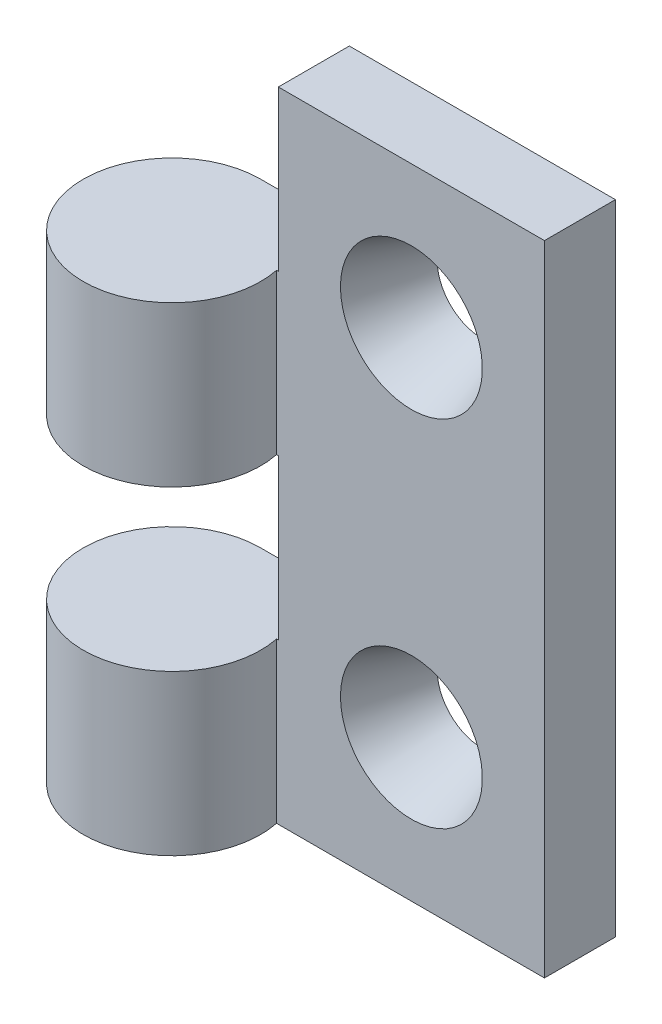
ISO-10303-21;
HEADER;
FILE_DESCRIPTION(('STEP AP214'),'2;1');
FILE_NAME('part.step','',(''),(''),'','','');
FILE_SCHEMA(('AUTOMOTIVE_DESIGN { 1 0 10303 214 1 1 1 1 }'));
ENDSEC;
DATA;
#1=APPLICATION_CONTEXT('core data for automotive mechanical design processes');
#2=APPLICATION_PROTOCOL_DEFINITION('international standard','automotive_design',2000,#1);
#3=PRODUCT_CONTEXT('',#1,'mechanical');
#4=PRODUCT('Part','Part','',(#3));
#5=PRODUCT_RELATED_PRODUCT_CATEGORY('part','',(#4));
#6=PRODUCT_DEFINITION_FORMATION('','',#4);
#7=PRODUCT_DEFINITION_CONTEXT('part definition',#1,'design');
#8=PRODUCT_DEFINITION('design','',#6,#7);
#9=PRODUCT_DEFINITION_SHAPE('','',#8);
#10=(LENGTH_UNIT() NAMED_UNIT(*) SI_UNIT(.MILLI.,.METRE.));
#11=(NAMED_UNIT(*) PLANE_ANGLE_UNIT() SI_UNIT($,.RADIAN.));
#12=(NAMED_UNIT(*) SI_UNIT($,.STERADIAN.) SOLID_ANGLE_UNIT());
#13=UNCERTAINTY_MEASURE_WITH_UNIT(LENGTH_MEASURE(1.E-05),#10,'distance_accuracy_value','');
#14=(GEOMETRIC_REPRESENTATION_CONTEXT(3) GLOBAL_UNCERTAINTY_ASSIGNED_CONTEXT((#13)) GLOBAL_UNIT_ASSIGNED_CONTEXT((#10,
#11,#12)) REPRESENTATION_CONTEXT('',''));
#15=CARTESIAN_POINT('',(0.,0.,0.));
#16=DIRECTION('',(0.,0.,1.));
#17=DIRECTION('',(1.,0.,0.));
#18=AXIS2_PLACEMENT_3D('',#15,#16,#17);
#19=CARTESIAN_POINT('',(0.,0.,4.));
#20=DIRECTION('',(0.,0.,-1.));
#21=DIRECTION('',(-1.,0.,0.));
#22=AXIS2_PLACEMENT_3D('',#19,#20,#21);
#23=PLANE('',#22);
#24=CARTESIAN_POINT('',(-7.5,28.,4.));
#25=DIRECTION('',(0.,0.,-1.));
#26=DIRECTION('',(-1.,0.,0.));
#27=AXIS2_PLACEMENT_3D('',#24,#25,#26);
#28=CIRCLE('',#27,4.00000000000002);
#29=CARTESIAN_POINT('',(-11.5,28.,4.));
#30=VERTEX_POINT('',#29);
#31=EDGE_CURVE('E131',#30,#30,#28,.T.);
#32=ORIENTED_EDGE('',*,*,#31,.T.);
#33=EDGE_LOOP('',(#32));
#34=FACE_BOUND('',#33,.T.);
#35=CARTESIAN_POINT('',(-7.5,8.,4.));
#36=DIRECTION('',(0.,0.,-1.));
#37=DIRECTION('',(-1.,0.,0.));
#38=AXIS2_PLACEMENT_3D('',#35,#36,#37);
#39=CIRCLE('',#38,4.00000000000003);
#40=CARTESIAN_POINT('',(-11.5,8.,4.));
#41=VERTEX_POINT('',#40);
#42=EDGE_CURVE('E133',#41,#41,#39,.T.);
#43=ORIENTED_EDGE('',*,*,#42,.T.);
#44=EDGE_LOOP('',(#43));
#45=FACE_BOUND('',#44,.T.);
#46=DIRECTION('',(1.,0.,0.));
#47=VECTOR('',#46,1.);
#48=CARTESIAN_POINT('',(0.,9.,4.));
#49=LINE('',#48,#47);
#50=CARTESIAN_POINT('',(-15.1010205144336,9.,4.));
#51=VERTEX_POINT('',#50);
#52=CARTESIAN_POINT('',(-15.,9.,4.));
#53=VERTEX_POINT('',#52);
#54=EDGE_CURVE('E192',#51,#53,#49,.T.);
#55=ORIENTED_EDGE('',*,*,#54,.F.);
#56=DIRECTION('',(0.,-1.,0.));
#57=VECTOR('',#56,1.);
#58=CARTESIAN_POINT('',(-15.1010205144336,36.,4.));
#59=LINE('',#58,#57);
#60=CARTESIAN_POINT('',(-15.1010205144336,0.,4.));
#61=VERTEX_POINT('',#60);
#62=EDGE_CURVE('E63',#51,#61,#59,.T.);
#63=ORIENTED_EDGE('',*,*,#62,.T.);
#64=DIRECTION('',(1.,0.,0.));
#65=VECTOR('',#64,1.);
#66=CARTESIAN_POINT('',(0.,0.,4.));
#67=LINE('',#66,#65);
#68=CARTESIAN_POINT('',(0.,0.,4.));
#69=VERTEX_POINT('',#68);
#70=EDGE_CURVE('E180',#61,#69,#67,.T.);
#71=ORIENTED_EDGE('',*,*,#70,.T.);
#72=DIRECTION('',(0.,1.,0.));
#73=VECTOR('',#72,1.);
#74=CARTESIAN_POINT('',(0.,0.,4.));
#75=LINE('',#74,#73);
#76=CARTESIAN_POINT('',(0.,36.,4.));
#77=VERTEX_POINT('',#76);
#78=EDGE_CURVE('E71',#69,#77,#75,.T.);
#79=ORIENTED_EDGE('',*,*,#78,.T.);
#80=DIRECTION('',(-1.,0.,0.));
#81=VECTOR('',#80,1.);
#82=CARTESIAN_POINT('',(0.,36.,4.));
#83=LINE('',#82,#81);
#84=CARTESIAN_POINT('',(-15.,36.,4.));
#85=VERTEX_POINT('',#84);
#86=EDGE_CURVE('E101',#77,#85,#83,.T.);
#87=ORIENTED_EDGE('',*,*,#86,.T.);
#88=DIRECTION('',(0.,-1.,0.));
#89=VECTOR('',#88,1.);
#90=CARTESIAN_POINT('',(-15.,0.,4.));
#91=LINE('',#90,#89);
#92=CARTESIAN_POINT('',(-15.,27.,4.));
#93=VERTEX_POINT('',#92);
#94=EDGE_CURVE('E214',#85,#93,#91,.T.);
#95=ORIENTED_EDGE('',*,*,#94,.T.);
#96=DIRECTION('',(1.,0.,0.));
#97=VECTOR('',#96,1.);
#98=CARTESIAN_POINT('',(0.,27.,4.));
#99=LINE('',#98,#97);
#100=CARTESIAN_POINT('',(-15.1010205144336,27.,4.));
#101=VERTEX_POINT('',#100);
#102=EDGE_CURVE('E210',#101,#93,#99,.T.);
#103=ORIENTED_EDGE('',*,*,#102,.F.);
#104=CARTESIAN_POINT('',(-15.1010205144336,18.,4.));
#105=VERTEX_POINT('',#104);
#106=EDGE_CURVE('E190',#101,#105,#59,.T.);
#107=ORIENTED_EDGE('',*,*,#106,.T.);
#108=DIRECTION('',(1.,0.,0.));
#109=VECTOR('',#108,1.);
#110=CARTESIAN_POINT('',(0.,18.,4.));
#111=LINE('',#110,#109);
#112=CARTESIAN_POINT('',(-15.,18.,4.));
#113=VERTEX_POINT('',#112);
#114=EDGE_CURVE('E160',#105,#113,#111,.T.);
#115=ORIENTED_EDGE('',*,*,#114,.T.);
#116=DIRECTION('',(0.,1.,0.));
#117=VECTOR('',#116,1.);
#118=CARTESIAN_POINT('',(-15.,0.,4.));
#119=LINE('',#118,#117);
#120=EDGE_CURVE('E200',#53,#113,#119,.T.);
#121=ORIENTED_EDGE('',*,*,#120,.F.);
#122=EDGE_LOOP('',(#55,#63,#71,#79,#87,#95,#103,#107,#115,#121));
#123=FACE_BOUND('',#122,.T.);
#124=ADVANCED_FACE('F50',(#34,#45,#123),#23,.F.);
#125=CARTESIAN_POINT('',(0.,0.,0.));
#126=DIRECTION('',(0.,0.,-1.));
#127=DIRECTION('',(-1.,0.,0.));
#128=AXIS2_PLACEMENT_3D('',#125,#126,#127);
#129=PLANE('',#128);
#130=DIRECTION('',(0.,-1.,0.));
#131=VECTOR('',#130,1.);
#132=CARTESIAN_POINT('',(-15.,36.,0.));
#133=LINE('',#132,#131);
#134=CARTESIAN_POINT('',(-15.,36.,0.));
#135=VERTEX_POINT('',#134);
#136=CARTESIAN_POINT('',(-15.,27.,0.));
#137=VERTEX_POINT('',#136);
#138=EDGE_CURVE('E111',#135,#137,#133,.T.);
#139=ORIENTED_EDGE('',*,*,#138,.F.);
#140=DIRECTION('',(-1.,0.,0.));
#141=VECTOR('',#140,1.);
#142=CARTESIAN_POINT('',(0.,36.,0.));
#143=LINE('',#142,#141);
#144=CARTESIAN_POINT('',(0.,36.,0.));
#145=VERTEX_POINT('',#144);
#146=EDGE_CURVE('E94',#145,#135,#143,.T.);
#147=ORIENTED_EDGE('',*,*,#146,.F.);
#148=DIRECTION('',(0.,1.,0.));
#149=VECTOR('',#148,1.);
#150=CARTESIAN_POINT('',(0.,0.,0.));
#151=LINE('',#150,#149);
#152=CARTESIAN_POINT('',(0.,0.,0.));
#153=VERTEX_POINT('',#152);
#154=EDGE_CURVE('E85',#153,#145,#151,.T.);
#155=ORIENTED_EDGE('',*,*,#154,.F.);
#156=DIRECTION('',(1.,0.,0.));
#157=VECTOR('',#156,1.);
#158=CARTESIAN_POINT('',(0.,0.,0.));
#159=LINE('',#158,#157);
#160=CARTESIAN_POINT('',(-20.,0.,0.));
#161=VERTEX_POINT('',#160);
#162=EDGE_CURVE('E98',#161,#153,#159,.T.);
#163=ORIENTED_EDGE('',*,*,#162,.F.);
#164=DIRECTION('',(0.,-1.,0.));
#165=VECTOR('',#164,1.);
#166=CARTESIAN_POINT('',(-20.,0.,0.));
#167=LINE('',#166,#165);
#168=CARTESIAN_POINT('',(-20.,9.,0.));
#169=VERTEX_POINT('',#168);
#170=EDGE_CURVE('E113',#169,#161,#167,.T.);
#171=ORIENTED_EDGE('',*,*,#170,.F.);
#172=DIRECTION('',(1.,0.,0.));
#173=VECTOR('',#172,1.);
#174=CARTESIAN_POINT('',(-25.,9.,0.));
#175=LINE('',#174,#173);
#176=CARTESIAN_POINT('',(-15.,9.,0.));
#177=VERTEX_POINT('',#176);
#178=EDGE_CURVE('E217',#169,#177,#175,.T.);
#179=ORIENTED_EDGE('',*,*,#178,.T.);
#180=DIRECTION('',(0.,1.,0.));
#181=VECTOR('',#180,1.);
#182=CARTESIAN_POINT('',(-15.,9.,0.));
#183=LINE('',#182,#181);
#184=CARTESIAN_POINT('',(-15.,18.,0.));
#185=VERTEX_POINT('',#184);
#186=EDGE_CURVE('E169',#177,#185,#183,.T.);
#187=ORIENTED_EDGE('',*,*,#186,.T.);
#188=DIRECTION('',(1.,0.,0.));
#189=VECTOR('',#188,1.);
#190=CARTESIAN_POINT('',(-25.,18.,0.));
#191=LINE('',#190,#189);
#192=CARTESIAN_POINT('',(-20.,18.,0.));
#193=VERTEX_POINT('',#192);
#194=EDGE_CURVE('E152',#193,#185,#191,.T.);
#195=ORIENTED_EDGE('',*,*,#194,.F.);
#196=CARTESIAN_POINT('',(-20.,27.,0.));
#197=VERTEX_POINT('',#196);
#198=EDGE_CURVE('E120',#197,#193,#167,.T.);
#199=ORIENTED_EDGE('',*,*,#198,.F.);
#200=DIRECTION('',(1.,0.,0.));
#201=VECTOR('',#200,1.);
#202=CARTESIAN_POINT('',(-25.,27.,0.));
#203=LINE('',#202,#201);
#204=EDGE_CURVE('E220',#197,#137,#203,.T.);
#205=ORIENTED_EDGE('',*,*,#204,.T.);
#206=EDGE_LOOP('',(#139,#147,#155,#163,#171,#179,#187,#195,#199,#205));
#207=FACE_BOUND('',#206,.T.);
#208=CARTESIAN_POINT('',(-7.5,28.,0.));
#209=DIRECTION('',(0.,0.,-1.));
#210=DIRECTION('',(-1.,0.,0.));
#211=AXIS2_PLACEMENT_3D('',#208,#209,#210);
#212=CIRCLE('',#211,2.54411906293523);
#213=CARTESIAN_POINT('',(-10.0441190629352,28.,0.));
#214=VERTEX_POINT('',#213);
#215=EDGE_CURVE('E126',#214,#214,#212,.F.);
#216=ORIENTED_EDGE('',*,*,#215,.T.);
#217=EDGE_LOOP('',(#216));
#218=FACE_BOUND('',#217,.T.);
#219=CARTESIAN_POINT('',(-7.5,8.,0.));
#220=DIRECTION('',(0.,0.,-1.));
#221=DIRECTION('',(-1.,0.,0.));
#222=AXIS2_PLACEMENT_3D('',#219,#220,#221);
#223=CIRCLE('',#222,2.54411906293523);
#224=CARTESIAN_POINT('',(-10.0441190629352,8.,0.));
#225=VERTEX_POINT('',#224);
#226=EDGE_CURVE('E124',#225,#225,#223,.F.);
#227=ORIENTED_EDGE('',*,*,#226,.T.);
#228=EDGE_LOOP('',(#227));
#229=FACE_BOUND('',#228,.T.);
#230=ADVANCED_FACE('F110',(#207,#218,#229),#129,.T.);
#231=CARTESIAN_POINT('',(0.,36.,4.));
#232=DIRECTION('',(0.,-1.,0.));
#233=DIRECTION('',(0.,0.,-1.));
#234=AXIS2_PLACEMENT_3D('',#231,#232,#233);
#235=PLANE('',#234);
#236=DIRECTION('',(0.,0.,-1.));
#237=VECTOR('',#236,1.);
#238=CARTESIAN_POINT('',(-15.,36.,10.));
#239=LINE('',#238,#237);
#240=EDGE_CURVE('E225',#85,#135,#239,.T.);
#241=ORIENTED_EDGE('',*,*,#240,.F.);
#242=ORIENTED_EDGE('',*,*,#86,.F.);
#243=DIRECTION('',(0.,0.,-1.));
#244=VECTOR('',#243,1.);
#245=CARTESIAN_POINT('',(0.,36.,4.));
#246=LINE('',#245,#244);
#247=EDGE_CURVE('E88',#77,#145,#246,.T.);
#248=ORIENTED_EDGE('',*,*,#247,.T.);
#249=ORIENTED_EDGE('',*,*,#146,.T.);
#250=EDGE_LOOP('',(#241,#242,#248,#249));
#251=FACE_BOUND('',#250,.T.);
#252=ADVANCED_FACE('F103',(#251),#235,.F.);
#253=CARTESIAN_POINT('',(-20.,36.,5.));
#254=DIRECTION('',(0.,-1.,0.));
#255=DIRECTION('',(0.,0.,-1.));
#256=AXIS2_PLACEMENT_3D('',#253,#254,#255);
#257=CYLINDRICAL_SURFACE('',#256,5.);
#258=CARTESIAN_POINT('',(-20.,9.,5.));
#259=DIRECTION('',(0.,1.,0.));
#260=DIRECTION('',(0.,0.,1.));
#261=AXIS2_PLACEMENT_3D('',#258,#259,#260);
#262=CIRCLE('',#261,5.);
#263=EDGE_CURVE('E11',#51,#169,#262,.F.);
#264=ORIENTED_EDGE('',*,*,#263,.T.);
#265=ORIENTED_EDGE('',*,*,#170,.T.);
#266=CARTESIAN_POINT('',(-20.,0.,5.));
#267=DIRECTION('',(0.,-1.,0.));
#268=DIRECTION('',(0.,0.,-1.));
#269=AXIS2_PLACEMENT_3D('',#266,#267,#268);
#270=CIRCLE('',#269,5.);
#271=EDGE_CURVE('E195',#61,#161,#270,.T.);
#272=ORIENTED_EDGE('',*,*,#271,.F.);
#273=ORIENTED_EDGE('',*,*,#62,.F.);
#274=EDGE_LOOP('',(#264,#265,#272,#273));
#275=FACE_BOUND('',#274,.T.);
#276=ADVANCED_FACE('F258',(#275),#257,.T.);
#277=ORIENTED_EDGE('',*,*,#198,.T.);
#278=CARTESIAN_POINT('',(-20.,18.,5.));
#279=DIRECTION('',(0.,1.,0.));
#280=DIRECTION('',(0.,0.,1.));
#281=AXIS2_PLACEMENT_3D('',#278,#279,#280);
#282=CIRCLE('',#281,5.);
#283=EDGE_CURVE('E60',#105,#193,#282,.F.);
#284=ORIENTED_EDGE('',*,*,#283,.F.);
#285=ORIENTED_EDGE('',*,*,#106,.F.);
#286=CARTESIAN_POINT('',(-20.,27.,5.));
#287=DIRECTION('',(0.,1.,0.));
#288=DIRECTION('',(0.,0.,1.));
#289=AXIS2_PLACEMENT_3D('',#286,#287,#288);
#290=CIRCLE('',#289,5.);
#291=EDGE_CURVE('E137',#101,#197,#290,.F.);
#292=ORIENTED_EDGE('',*,*,#291,.T.);
#293=EDGE_LOOP('',(#277,#284,#285,#292));
#294=FACE_BOUND('',#293,.T.);
#295=ADVANCED_FACE('F173',(#294),#257,.T.);
#296=CARTESIAN_POINT('',(0.,0.,4.));
#297=DIRECTION('',(0.,1.,0.));
#298=DIRECTION('',(0.,0.,1.));
#299=AXIS2_PLACEMENT_3D('',#296,#297,#298);
#300=PLANE('',#299);
#301=ORIENTED_EDGE('',*,*,#70,.F.);
#302=ORIENTED_EDGE('',*,*,#271,.T.);
#303=ORIENTED_EDGE('',*,*,#162,.T.);
#304=DIRECTION('',(0.,0.,-1.));
#305=VECTOR('',#304,1.);
#306=CARTESIAN_POINT('',(0.,0.,4.));
#307=LINE('',#306,#305);
#308=EDGE_CURVE('E90',#69,#153,#307,.T.);
#309=ORIENTED_EDGE('',*,*,#308,.F.);
#310=EDGE_LOOP('',(#301,#302,#303,#309));
#311=FACE_BOUND('',#310,.T.);
#312=ADVANCED_FACE('F266',(#311),#300,.F.);
#313=CARTESIAN_POINT('',(0.,0.,4.));
#314=DIRECTION('',(-1.,0.,0.));
#315=DIRECTION('',(0.,0.,1.));
#316=AXIS2_PLACEMENT_3D('',#313,#314,#315);
#317=PLANE('',#316);
#318=ORIENTED_EDGE('',*,*,#154,.T.);
#319=ORIENTED_EDGE('',*,*,#247,.F.);
#320=ORIENTED_EDGE('',*,*,#78,.F.);
#321=ORIENTED_EDGE('',*,*,#308,.T.);
#322=EDGE_LOOP('',(#318,#319,#320,#321));
#323=FACE_BOUND('',#322,.T.);
#324=ADVANCED_FACE('F82',(#323),#317,.F.);
#325=CARTESIAN_POINT('',(-7.5,28.,-0.121216129182052));
#326=DIRECTION('',(0.,0.,1.));
#327=DIRECTION('',(1.,0.,0.));
#328=AXIS2_PLACEMENT_3D('',#325,#326,#327);
#329=CONICAL_SURFACE('',#328,2.49999999999999,0.349065850398863);
#330=ORIENTED_EDGE('',*,*,#31,.F.);
#331=EDGE_LOOP('',(#330));
#332=FACE_BOUND('',#331,.T.);
#333=ORIENTED_EDGE('',*,*,#215,.F.);
#334=EDGE_LOOP('',(#333));
#335=FACE_BOUND('',#334,.T.);
#336=ADVANCED_FACE('F283',(#332,#335),#329,.F.);
#337=CARTESIAN_POINT('',(-7.5,8.,-0.121216129182052));
#338=DIRECTION('',(0.,0.,1.));
#339=DIRECTION('',(1.,0.,0.));
#340=AXIS2_PLACEMENT_3D('',#337,#338,#339);
#341=CONICAL_SURFACE('',#340,2.5,0.349065850398863);
#342=ORIENTED_EDGE('',*,*,#42,.F.);
#343=EDGE_LOOP('',(#342));
#344=FACE_BOUND('',#343,.T.);
#345=ORIENTED_EDGE('',*,*,#226,.F.);
#346=EDGE_LOOP('',(#345));
#347=FACE_BOUND('',#346,.T.);
#348=ADVANCED_FACE('F49',(#344,#347),#341,.F.);
#349=CARTESIAN_POINT('',(-25.,27.,10.));
#350=DIRECTION('',(0.,1.,0.));
#351=DIRECTION('',(0.,0.,1.));
#352=AXIS2_PLACEMENT_3D('',#349,#350,#351);
#353=PLANE('',#352);
#354=ORIENTED_EDGE('',*,*,#204,.F.);
#355=ORIENTED_EDGE('',*,*,#291,.F.);
#356=ORIENTED_EDGE('',*,*,#102,.T.);
#357=DIRECTION('',(0.,0.,-1.));
#358=VECTOR('',#357,1.);
#359=CARTESIAN_POINT('',(-15.,27.,10.));
#360=LINE('',#359,#358);
#361=EDGE_CURVE('E223',#93,#137,#360,.T.);
#362=ORIENTED_EDGE('',*,*,#361,.T.);
#363=EDGE_LOOP('',(#354,#355,#356,#362));
#364=FACE_BOUND('',#363,.T.);
#365=ADVANCED_FACE('F289',(#364),#353,.T.);
#366=CARTESIAN_POINT('',(-15.,36.,10.));
#367=DIRECTION('',(1.,0.,0.));
#368=DIRECTION('',(0.,0.,-1.));
#369=AXIS2_PLACEMENT_3D('',#366,#367,#368);
#370=PLANE('',#369);
#371=ORIENTED_EDGE('',*,*,#240,.T.);
#372=ORIENTED_EDGE('',*,*,#138,.T.);
#373=ORIENTED_EDGE('',*,*,#361,.F.);
#374=ORIENTED_EDGE('',*,*,#94,.F.);
#375=EDGE_LOOP('',(#371,#372,#373,#374));
#376=FACE_BOUND('',#375,.T.);
#377=ADVANCED_FACE('F301',(#376),#370,.F.);
#378=CARTESIAN_POINT('',(-25.,9.,10.));
#379=DIRECTION('',(0.,1.,0.));
#380=DIRECTION('',(0.,0.,1.));
#381=AXIS2_PLACEMENT_3D('',#378,#379,#380);
#382=PLANE('',#381);
#383=ORIENTED_EDGE('',*,*,#178,.F.);
#384=ORIENTED_EDGE('',*,*,#263,.F.);
#385=ORIENTED_EDGE('',*,*,#54,.T.);
#386=DIRECTION('',(0.,0.,-1.));
#387=VECTOR('',#386,1.);
#388=CARTESIAN_POINT('',(-15.,9.,10.));
#389=LINE('',#388,#387);
#390=EDGE_CURVE('E212',#53,#177,#389,.T.);
#391=ORIENTED_EDGE('',*,*,#390,.T.);
#392=EDGE_LOOP('',(#383,#384,#385,#391));
#393=FACE_BOUND('',#392,.T.);
#394=ADVANCED_FACE('F244',(#393),#382,.T.);
#395=CARTESIAN_POINT('',(-15.,9.,10.));
#396=DIRECTION('',(-1.,0.,0.));
#397=DIRECTION('',(0.,-1.,0.));
#398=AXIS2_PLACEMENT_3D('',#395,#396,#397);
#399=PLANE('',#398);
#400=ORIENTED_EDGE('',*,*,#120,.T.);
#401=DIRECTION('',(0.,0.,-1.));
#402=VECTOR('',#401,1.);
#403=CARTESIAN_POINT('',(-15.,18.,10.));
#404=LINE('',#403,#402);
#405=EDGE_CURVE('E171',#113,#185,#404,.T.);
#406=ORIENTED_EDGE('',*,*,#405,.T.);
#407=ORIENTED_EDGE('',*,*,#186,.F.);
#408=ORIENTED_EDGE('',*,*,#390,.F.);
#409=EDGE_LOOP('',(#400,#406,#407,#408));
#410=FACE_BOUND('',#409,.T.);
#411=ADVANCED_FACE('F306',(#410),#399,.T.);
#412=CARTESIAN_POINT('',(-25.,18.,10.));
#413=DIRECTION('',(0.,1.,0.));
#414=DIRECTION('',(0.,0.,1.));
#415=AXIS2_PLACEMENT_3D('',#412,#413,#414);
#416=PLANE('',#415);
#417=ORIENTED_EDGE('',*,*,#283,.T.);
#418=ORIENTED_EDGE('',*,*,#194,.T.);
#419=ORIENTED_EDGE('',*,*,#405,.F.);
#420=ORIENTED_EDGE('',*,*,#114,.F.);
#421=EDGE_LOOP('',(#417,#418,#419,#420));
#422=FACE_BOUND('',#421,.T.);
#423=ADVANCED_FACE('F147',(#422),#416,.F.);
#424=CLOSED_SHELL('',(#124,#230,#252,#276,#295,#312,#324,#336,#348,#365,#377,#394,#411,#423));
#425=MANIFOLD_SOLID_BREP('B2',#424);
#426=ADVANCED_BREP_SHAPE_REPRESENTATION('',(#18,#425),#14);
#427=SHAPE_DEFINITION_REPRESENTATION(#9,#426);
ENDSEC;
END-ISO-10303-21;
